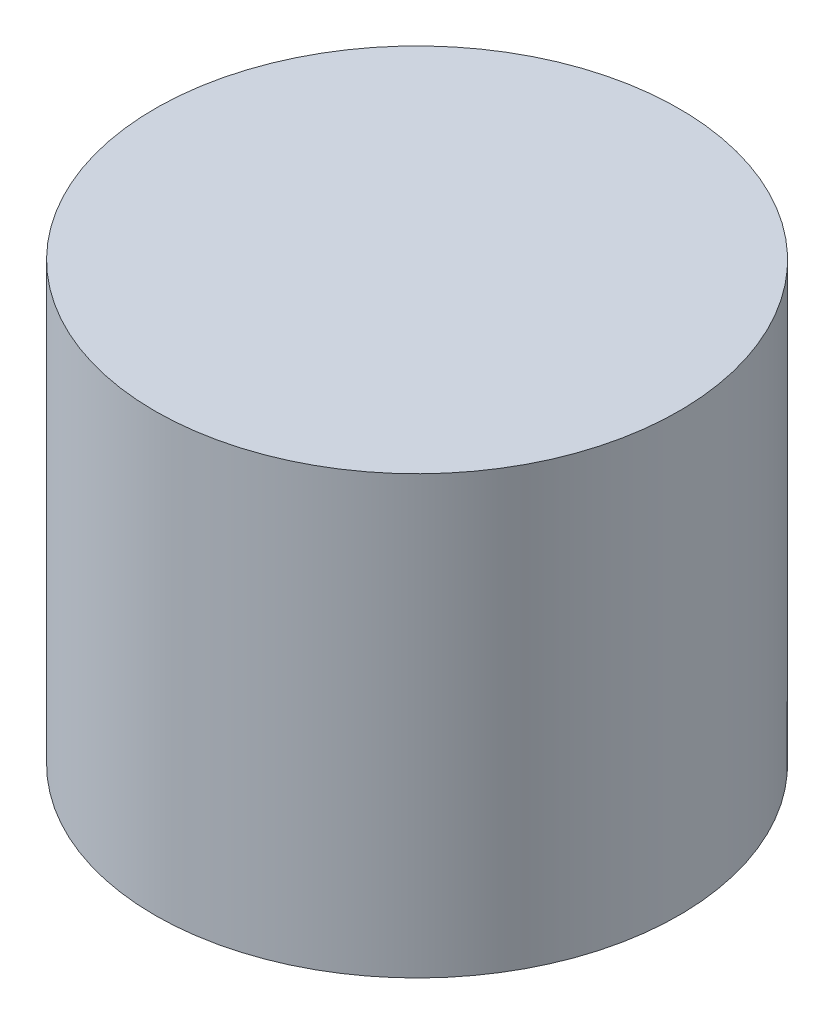
ISO-10303-21;
HEADER;
FILE_DESCRIPTION(('STEP AP214'),'2;1');
FILE_NAME('part.step','',(''),(''),'','','');
FILE_SCHEMA(('AUTOMOTIVE_DESIGN { 1 0 10303 214 1 1 1 1 }'));
ENDSEC;
DATA;
#1=APPLICATION_CONTEXT('core data for automotive mechanical design processes');
#2=APPLICATION_PROTOCOL_DEFINITION('international standard','automotive_design',2000,#1);
#3=PRODUCT_CONTEXT('',#1,'mechanical');
#4=PRODUCT('Part','Part','',(#3));
#5=PRODUCT_RELATED_PRODUCT_CATEGORY('part','',(#4));
#6=PRODUCT_DEFINITION_FORMATION('','',#4);
#7=PRODUCT_DEFINITION_CONTEXT('part definition',#1,'design');
#8=PRODUCT_DEFINITION('design','',#6,#7);
#9=PRODUCT_DEFINITION_SHAPE('','',#8);
#10=(LENGTH_UNIT() NAMED_UNIT(*) SI_UNIT(.MILLI.,.METRE.));
#11=(NAMED_UNIT(*) PLANE_ANGLE_UNIT() SI_UNIT($,.RADIAN.));
#12=(NAMED_UNIT(*) SI_UNIT($,.STERADIAN.) SOLID_ANGLE_UNIT());
#13=UNCERTAINTY_MEASURE_WITH_UNIT(LENGTH_MEASURE(1.E-05),#10,'distance_accuracy_value','');
#14=(GEOMETRIC_REPRESENTATION_CONTEXT(3) GLOBAL_UNCERTAINTY_ASSIGNED_CONTEXT((#13)) GLOBAL_UNIT_ASSIGNED_CONTEXT((#10,
#11,#12)) REPRESENTATION_CONTEXT('',''));
#15=CARTESIAN_POINT('',(0.,0.,0.));
#16=DIRECTION('',(0.,0.,1.));
#17=DIRECTION('',(1.,0.,0.));
#18=AXIS2_PLACEMENT_3D('',#15,#16,#17);
#19=CARTESIAN_POINT('',(0.,5.,0.));
#20=DIRECTION('',(0.,-1.,0.));
#21=DIRECTION('',(0.,0.,-1.));
#22=AXIS2_PLACEMENT_3D('',#19,#20,#21);
#23=CYLINDRICAL_SURFACE('',#22,3.);
#24=CARTESIAN_POINT('',(0.,5.,0.));
#25=DIRECTION('',(0.,1.,0.));
#26=DIRECTION('',(0.,0.,1.));
#27=AXIS2_PLACEMENT_3D('',#24,#25,#26);
#28=CIRCLE('',#27,3.);
#29=CARTESIAN_POINT('',(0.,5.,3.));
#30=VERTEX_POINT('',#29);
#31=EDGE_CURVE('E10',#30,#30,#28,.T.);
#32=ORIENTED_EDGE('',*,*,#31,.F.);
#33=EDGE_LOOP('',(#32));
#34=FACE_BOUND('',#33,.T.);
#35=CARTESIAN_POINT('',(0.,0.,0.));
#36=DIRECTION('',(0.,1.,0.));
#37=DIRECTION('',(0.,0.,1.));
#38=AXIS2_PLACEMENT_3D('',#35,#36,#37);
#39=CIRCLE('',#38,3.);
#40=CARTESIAN_POINT('',(0.,0.,3.));
#41=VERTEX_POINT('',#40);
#42=EDGE_CURVE('E34',#41,#41,#39,.T.);
#43=ORIENTED_EDGE('',*,*,#42,.T.);
#44=EDGE_LOOP('',(#43));
#45=FACE_BOUND('',#44,.T.);
#46=ADVANCED_FACE('F31',(#34,#45),#23,.T.);
#47=CARTESIAN_POINT('',(0.,5.,0.));
#48=DIRECTION('',(0.,1.,0.));
#49=DIRECTION('',(0.,0.,1.));
#50=AXIS2_PLACEMENT_3D('',#47,#48,#49);
#51=PLANE('',#50);
#52=ORIENTED_EDGE('',*,*,#31,.T.);
#53=EDGE_LOOP('',(#52));
#54=FACE_BOUND('',#53,.T.);
#55=ADVANCED_FACE('F46',(#54),#51,.T.);
#56=CARTESIAN_POINT('',(0.,0.,0.));
#57=DIRECTION('',(0.,1.,0.));
#58=DIRECTION('',(0.,0.,1.));
#59=AXIS2_PLACEMENT_3D('',#56,#57,#58);
#60=PLANE('',#59);
#61=ORIENTED_EDGE('',*,*,#42,.F.);
#62=EDGE_LOOP('',(#61));
#63=FACE_BOUND('',#62,.T.);
#64=ADVANCED_FACE('F44',(#63),#60,.F.);
#65=CLOSED_SHELL('',(#46,#55,#64));
#66=MANIFOLD_SOLID_BREP('B2',#65);
#67=ADVANCED_BREP_SHAPE_REPRESENTATION('',(#18,#66),#14);
#68=SHAPE_DEFINITION_REPRESENTATION(#9,#67);
ENDSEC;
END-ISO-10303-21;
